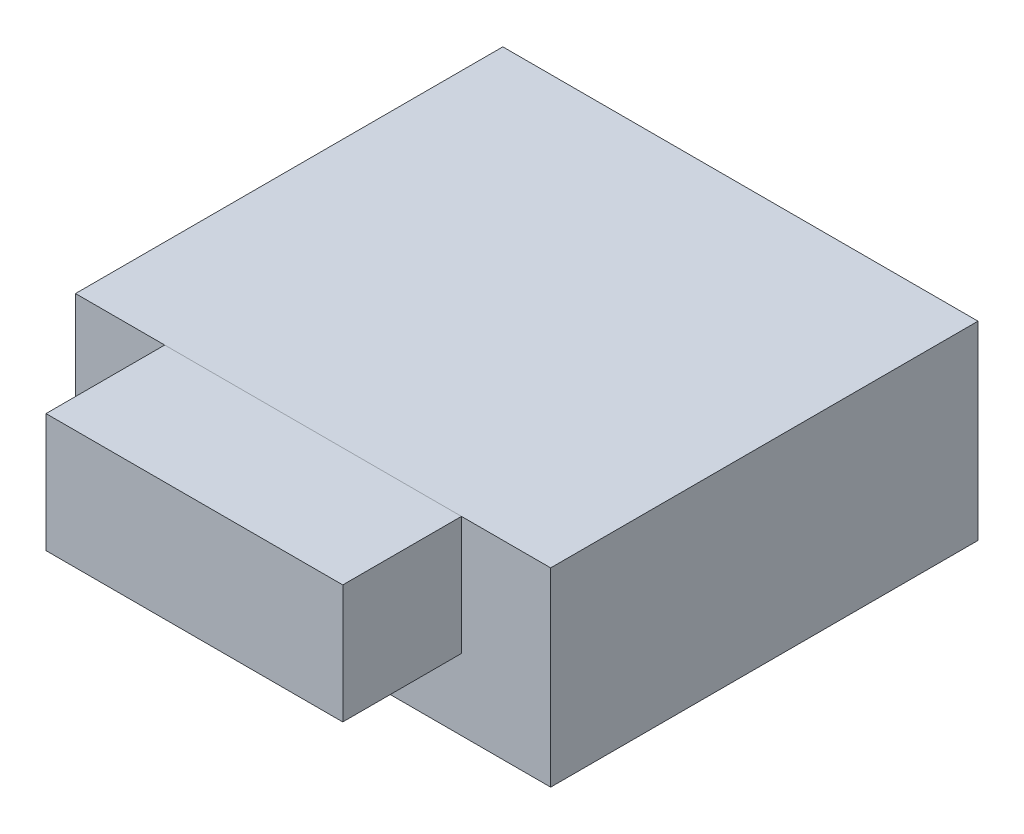
ISO-10303-21;
HEADER;
FILE_DESCRIPTION(('STEP AP214'),'2;1');
FILE_NAME('part.step','',(''),(''),'','','');
FILE_SCHEMA(('AUTOMOTIVE_DESIGN { 1 0 10303 214 1 1 1 1 }'));
ENDSEC;
DATA;
#1=APPLICATION_CONTEXT('core data for automotive mechanical design processes');
#2=APPLICATION_PROTOCOL_DEFINITION('international standard','automotive_design',2000,#1);
#3=PRODUCT_CONTEXT('',#1,'mechanical');
#4=PRODUCT('Part','Part','',(#3));
#5=PRODUCT_RELATED_PRODUCT_CATEGORY('part','',(#4));
#6=PRODUCT_DEFINITION_FORMATION('','',#4);
#7=PRODUCT_DEFINITION_CONTEXT('part definition',#1,'design');
#8=PRODUCT_DEFINITION('design','',#6,#7);
#9=PRODUCT_DEFINITION_SHAPE('','',#8);
#10=(LENGTH_UNIT() NAMED_UNIT(*) SI_UNIT(.MILLI.,.METRE.));
#11=(NAMED_UNIT(*) PLANE_ANGLE_UNIT() SI_UNIT($,.RADIAN.));
#12=(NAMED_UNIT(*) SI_UNIT($,.STERADIAN.) SOLID_ANGLE_UNIT());
#13=UNCERTAINTY_MEASURE_WITH_UNIT(LENGTH_MEASURE(1.E-05),#10,'distance_accuracy_value','');
#14=(GEOMETRIC_REPRESENTATION_CONTEXT(3) GLOBAL_UNCERTAINTY_ASSIGNED_CONTEXT((#13)) GLOBAL_UNIT_ASSIGNED_CONTEXT((#10,
#11,#12)) REPRESENTATION_CONTEXT('',''));
#15=CARTESIAN_POINT('',(0.,0.,0.));
#16=DIRECTION('',(0.,0.,1.));
#17=DIRECTION('',(1.,0.,0.));
#18=AXIS2_PLACEMENT_3D('',#15,#16,#17);
#19=CARTESIAN_POINT('',(-1.25,0.6,2.8));
#20=DIRECTION('',(1.,0.,0.));
#21=DIRECTION('',(0.,0.,-1.));
#22=AXIS2_PLACEMENT_3D('',#19,#20,#21);
#23=PLANE('',#22);
#24=DIRECTION('',(0.,-1.,0.));
#25=VECTOR('',#24,1.);
#26=CARTESIAN_POINT('',(-1.25,0.6,1.8));
#27=LINE('',#26,#25);
#28=CARTESIAN_POINT('',(-1.25,1.6,1.8));
#29=VERTEX_POINT('',#28);
#30=CARTESIAN_POINT('',(-1.25,0.6,1.8));
#31=VERTEX_POINT('',#30);
#32=EDGE_CURVE('E111',#29,#31,#27,.T.);
#33=ORIENTED_EDGE('',*,*,#32,.T.);
#34=DIRECTION('',(0.,0.,-1.));
#35=VECTOR('',#34,1.);
#36=CARTESIAN_POINT('',(-1.25,0.6,2.8));
#37=LINE('',#36,#35);
#38=CARTESIAN_POINT('',(-1.25,0.6,2.8));
#39=VERTEX_POINT('',#38);
#40=EDGE_CURVE('E12',#39,#31,#37,.T.);
#41=ORIENTED_EDGE('',*,*,#40,.F.);
#42=DIRECTION('',(0.,-1.,0.));
#43=VECTOR('',#42,1.);
#44=CARTESIAN_POINT('',(-1.25,0.6,2.8));
#45=LINE('',#44,#43);
#46=CARTESIAN_POINT('',(-1.25,1.6,2.8));
#47=VERTEX_POINT('',#46);
#48=EDGE_CURVE('E99',#47,#39,#45,.T.);
#49=ORIENTED_EDGE('',*,*,#48,.F.);
#50=DIRECTION('',(0.,0.,-1.));
#51=VECTOR('',#50,1.);
#52=CARTESIAN_POINT('',(-1.25,1.6,2.8));
#53=LINE('',#52,#51);
#54=EDGE_CURVE('E107',#47,#29,#53,.T.);
#55=ORIENTED_EDGE('',*,*,#54,.T.);
#56=EDGE_LOOP('',(#33,#41,#49,#55));
#57=FACE_BOUND('',#56,.T.);
#58=ADVANCED_FACE('F48',(#57),#23,.F.);
#59=CARTESIAN_POINT('',(1.25,0.6,2.8));
#60=DIRECTION('',(0.,1.,0.));
#61=DIRECTION('',(-1.,0.,0.));
#62=AXIS2_PLACEMENT_3D('',#59,#60,#61);
#63=PLANE('',#62);
#64=DIRECTION('',(1.,0.,0.));
#65=VECTOR('',#64,1.);
#66=CARTESIAN_POINT('',(1.25,0.6,1.8));
#67=LINE('',#66,#65);
#68=CARTESIAN_POINT('',(1.25,0.6,1.8));
#69=VERTEX_POINT('',#68);
#70=EDGE_CURVE('E103',#31,#69,#67,.T.);
#71=ORIENTED_EDGE('',*,*,#70,.T.);
#72=DIRECTION('',(0.,0.,-1.));
#73=VECTOR('',#72,1.);
#74=CARTESIAN_POINT('',(1.25,0.6,2.8));
#75=LINE('',#74,#73);
#76=CARTESIAN_POINT('',(1.25,0.6,2.8));
#77=VERTEX_POINT('',#76);
#78=EDGE_CURVE('E56',#77,#69,#75,.T.);
#79=ORIENTED_EDGE('',*,*,#78,.F.);
#80=DIRECTION('',(1.,0.,0.));
#81=VECTOR('',#80,1.);
#82=CARTESIAN_POINT('',(1.25,0.6,2.8));
#83=LINE('',#82,#81);
#84=EDGE_CURVE('E94',#39,#77,#83,.T.);
#85=ORIENTED_EDGE('',*,*,#84,.F.);
#86=ORIENTED_EDGE('',*,*,#40,.T.);
#87=EDGE_LOOP('',(#71,#79,#85,#86));
#88=FACE_BOUND('',#87,.T.);
#89=ADVANCED_FACE('F102',(#88),#63,.F.);
#90=CARTESIAN_POINT('',(1.25,0.6,2.8));
#91=DIRECTION('',(-1.,0.,0.));
#92=DIRECTION('',(0.,0.,1.));
#93=AXIS2_PLACEMENT_3D('',#90,#91,#92);
#94=PLANE('',#93);
#95=DIRECTION('',(0.,1.,0.));
#96=VECTOR('',#95,1.);
#97=CARTESIAN_POINT('',(1.25,0.6,1.8));
#98=LINE('',#97,#96);
#99=CARTESIAN_POINT('',(1.25,1.6,1.8));
#100=VERTEX_POINT('',#99);
#101=EDGE_CURVE('E81',#69,#100,#98,.T.);
#102=ORIENTED_EDGE('',*,*,#101,.T.);
#103=DIRECTION('',(0.,0.,-1.));
#104=VECTOR('',#103,1.);
#105=CARTESIAN_POINT('',(1.25,1.6,2.8));
#106=LINE('',#105,#104);
#107=CARTESIAN_POINT('',(1.25,1.6,2.8));
#108=VERTEX_POINT('',#107);
#109=EDGE_CURVE('E104',#108,#100,#106,.T.);
#110=ORIENTED_EDGE('',*,*,#109,.F.);
#111=DIRECTION('',(0.,1.,0.));
#112=VECTOR('',#111,1.);
#113=CARTESIAN_POINT('',(1.25,0.6,2.8));
#114=LINE('',#113,#112);
#115=EDGE_CURVE('E97',#77,#108,#114,.T.);
#116=ORIENTED_EDGE('',*,*,#115,.F.);
#117=ORIENTED_EDGE('',*,*,#78,.T.);
#118=EDGE_LOOP('',(#102,#110,#116,#117));
#119=FACE_BOUND('',#118,.T.);
#120=ADVANCED_FACE('F105',(#119),#94,.F.);
#121=CARTESIAN_POINT('',(1.25,1.6,2.8));
#122=DIRECTION('',(0.,-1.,0.));
#123=DIRECTION('',(0.,0.,-1.));
#124=AXIS2_PLACEMENT_3D('',#121,#122,#123);
#125=PLANE('',#124);
#126=DIRECTION('',(-1.,0.,0.));
#127=VECTOR('',#126,1.);
#128=CARTESIAN_POINT('',(1.25,1.6,1.8));
#129=LINE('',#128,#127);
#130=EDGE_CURVE('E87',#100,#29,#129,.T.);
#131=ORIENTED_EDGE('',*,*,#130,.T.);
#132=ORIENTED_EDGE('',*,*,#54,.F.);
#133=DIRECTION('',(-1.,0.,0.));
#134=VECTOR('',#133,1.);
#135=CARTESIAN_POINT('',(1.25,1.6,2.8));
#136=LINE('',#135,#134);
#137=EDGE_CURVE('E64',#108,#47,#136,.T.);
#138=ORIENTED_EDGE('',*,*,#137,.F.);
#139=ORIENTED_EDGE('',*,*,#109,.T.);
#140=EDGE_LOOP('',(#131,#132,#138,#139));
#141=FACE_BOUND('',#140,.T.);
#142=ADVANCED_FACE('F118',(#141),#125,.F.);
#143=CARTESIAN_POINT('',(0.,0.,2.8));
#144=DIRECTION('',(0.,0.,1.));
#145=DIRECTION('',(1.,0.,0.));
#146=AXIS2_PLACEMENT_3D('',#143,#144,#145);
#147=PLANE('',#146);
#148=ORIENTED_EDGE('',*,*,#48,.T.);
#149=ORIENTED_EDGE('',*,*,#84,.T.);
#150=ORIENTED_EDGE('',*,*,#115,.T.);
#151=ORIENTED_EDGE('',*,*,#137,.T.);
#152=EDGE_LOOP('',(#148,#149,#150,#151));
#153=FACE_BOUND('',#152,.T.);
#154=ADVANCED_FACE('F95',(#153),#147,.T.);
#155=CARTESIAN_POINT('',(0.,0.,1.8));
#156=DIRECTION('',(0.,0.,1.));
#157=DIRECTION('',(1.,0.,0.));
#158=AXIS2_PLACEMENT_3D('',#155,#156,#157);
#159=PLANE('',#158);
#160=ORIENTED_EDGE('',*,*,#32,.F.);
#161=ORIENTED_EDGE('',*,*,#130,.F.);
#162=ORIENTED_EDGE('',*,*,#101,.F.);
#163=ORIENTED_EDGE('',*,*,#70,.F.);
#164=EDGE_LOOP('',(#160,#161,#162,#163));
#165=FACE_BOUND('',#164,.T.);
#166=ADVANCED_FACE('F121',(#165),#159,.F.);
#167=CLOSED_SHELL('',(#58,#89,#120,#142,#154,#166));
#168=MANIFOLD_SOLID_BREP('B2',#167);
#169=CARTESIAN_POINT('',(-2.00147782,1.6,1.8));
#170=DIRECTION('',(1.,0.,0.));
#171=DIRECTION('',(0.,0.,-1.));
#172=AXIS2_PLACEMENT_3D('',#169,#170,#171);
#173=PLANE('',#172);
#174=DIRECTION('',(0.,0.,1.));
#175=VECTOR('',#174,1.);
#176=CARTESIAN_POINT('',(-2.00147782,0.,1.8));
#177=LINE('',#176,#175);
#178=CARTESIAN_POINT('',(-2.00147782,0.,-1.8));
#179=VERTEX_POINT('',#178);
#180=CARTESIAN_POINT('',(-2.00147782,0.,1.8));
#181=VERTEX_POINT('',#180);
#182=EDGE_CURVE('E234',#179,#181,#177,.T.);
#183=ORIENTED_EDGE('',*,*,#182,.T.);
#184=DIRECTION('',(0.,-1.,0.));
#185=VECTOR('',#184,1.);
#186=CARTESIAN_POINT('',(-2.00147782,1.6,1.8));
#187=LINE('',#186,#185);
#188=CARTESIAN_POINT('',(-2.00147782,1.6,1.8));
#189=VERTEX_POINT('',#188);
#190=EDGE_CURVE('E46',#189,#181,#187,.T.);
#191=ORIENTED_EDGE('',*,*,#190,.F.);
#192=DIRECTION('',(0.,0.,1.));
#193=VECTOR('',#192,1.);
#194=CARTESIAN_POINT('',(-2.00147782,1.6,1.8));
#195=LINE('',#194,#193);
#196=CARTESIAN_POINT('',(-2.00147782,1.6,-1.8));
#197=VERTEX_POINT('',#196);
#198=EDGE_CURVE('E222',#197,#189,#195,.T.);
#199=ORIENTED_EDGE('',*,*,#198,.F.);
#200=DIRECTION('',(0.,-1.,0.));
#201=VECTOR('',#200,1.);
#202=CARTESIAN_POINT('',(-2.00147782,1.6,-1.8));
#203=LINE('',#202,#201);
#204=EDGE_CURVE('E230',#197,#179,#203,.T.);
#205=ORIENTED_EDGE('',*,*,#204,.T.);
#206=EDGE_LOOP('',(#183,#191,#199,#205));
#207=FACE_BOUND('',#206,.T.);
#208=ADVANCED_FACE('F171',(#207),#173,.F.);
#209=CARTESIAN_POINT('',(2.00147782,1.6,1.8));
#210=DIRECTION('',(0.,0.,-1.));
#211=DIRECTION('',(-1.,0.,0.));
#212=AXIS2_PLACEMENT_3D('',#209,#210,#211);
#213=PLANE('',#212);
#214=DIRECTION('',(1.,0.,0.));
#215=VECTOR('',#214,1.);
#216=CARTESIAN_POINT('',(2.00147782,0.,1.8));
#217=LINE('',#216,#215);
#218=CARTESIAN_POINT('',(2.00147782,0.,1.8));
#219=VERTEX_POINT('',#218);
#220=EDGE_CURVE('E226',#181,#219,#217,.T.);
#221=ORIENTED_EDGE('',*,*,#220,.T.);
#222=DIRECTION('',(0.,-1.,0.));
#223=VECTOR('',#222,1.);
#224=CARTESIAN_POINT('',(2.00147782,1.6,1.8));
#225=LINE('',#224,#223);
#226=CARTESIAN_POINT('',(2.00147782,1.6,1.8));
#227=VERTEX_POINT('',#226);
#228=EDGE_CURVE('E179',#227,#219,#225,.T.);
#229=ORIENTED_EDGE('',*,*,#228,.F.);
#230=DIRECTION('',(1.,0.,0.));
#231=VECTOR('',#230,1.);
#232=CARTESIAN_POINT('',(2.00147782,1.6,1.8));
#233=LINE('',#232,#231);
#234=EDGE_CURVE('E217',#189,#227,#233,.T.);
#235=ORIENTED_EDGE('',*,*,#234,.F.);
#236=ORIENTED_EDGE('',*,*,#190,.T.);
#237=EDGE_LOOP('',(#221,#229,#235,#236));
#238=FACE_BOUND('',#237,.T.);
#239=ADVANCED_FACE('F225',(#238),#213,.F.);
#240=CARTESIAN_POINT('',(2.00147782,1.6,1.8));
#241=DIRECTION('',(-1.,0.,0.));
#242=DIRECTION('',(0.,0.,1.));
#243=AXIS2_PLACEMENT_3D('',#240,#241,#242);
#244=PLANE('',#243);
#245=DIRECTION('',(0.,0.,-1.));
#246=VECTOR('',#245,1.);
#247=CARTESIAN_POINT('',(2.00147782,0.,1.8));
#248=LINE('',#247,#246);
#249=CARTESIAN_POINT('',(2.00147782,0.,-1.8));
#250=VERTEX_POINT('',#249);
#251=EDGE_CURVE('E204',#219,#250,#248,.T.);
#252=ORIENTED_EDGE('',*,*,#251,.T.);
#253=DIRECTION('',(0.,-1.,0.));
#254=VECTOR('',#253,1.);
#255=CARTESIAN_POINT('',(2.00147782,1.6,-1.8));
#256=LINE('',#255,#254);
#257=CARTESIAN_POINT('',(2.00147782,1.6,-1.8));
#258=VERTEX_POINT('',#257);
#259=EDGE_CURVE('E227',#258,#250,#256,.T.);
#260=ORIENTED_EDGE('',*,*,#259,.F.);
#261=DIRECTION('',(0.,0.,-1.));
#262=VECTOR('',#261,1.);
#263=CARTESIAN_POINT('',(2.00147782,1.6,1.8));
#264=LINE('',#263,#262);
#265=EDGE_CURVE('E220',#227,#258,#264,.T.);
#266=ORIENTED_EDGE('',*,*,#265,.F.);
#267=ORIENTED_EDGE('',*,*,#228,.T.);
#268=EDGE_LOOP('',(#252,#260,#266,#267));
#269=FACE_BOUND('',#268,.T.);
#270=ADVANCED_FACE('F228',(#269),#244,.F.);
#271=CARTESIAN_POINT('',(2.00147782,1.6,-1.8));
#272=DIRECTION('',(0.,0.,1.));
#273=DIRECTION('',(1.,0.,0.));
#274=AXIS2_PLACEMENT_3D('',#271,#272,#273);
#275=PLANE('',#274);
#276=DIRECTION('',(-1.,0.,0.));
#277=VECTOR('',#276,1.);
#278=CARTESIAN_POINT('',(2.00147782,0.,-1.8));
#279=LINE('',#278,#277);
#280=EDGE_CURVE('E210',#250,#179,#279,.T.);
#281=ORIENTED_EDGE('',*,*,#280,.T.);
#282=ORIENTED_EDGE('',*,*,#204,.F.);
#283=DIRECTION('',(-1.,0.,0.));
#284=VECTOR('',#283,1.);
#285=CARTESIAN_POINT('',(2.00147782,1.6,-1.8));
#286=LINE('',#285,#284);
#287=EDGE_CURVE('E187',#258,#197,#286,.T.);
#288=ORIENTED_EDGE('',*,*,#287,.F.);
#289=ORIENTED_EDGE('',*,*,#259,.T.);
#290=EDGE_LOOP('',(#281,#282,#288,#289));
#291=FACE_BOUND('',#290,.T.);
#292=ADVANCED_FACE('F241',(#291),#275,.F.);
#293=CARTESIAN_POINT('',(0.,1.6,0.));
#294=DIRECTION('',(0.,1.,0.));
#295=DIRECTION('',(0.,0.,1.));
#296=AXIS2_PLACEMENT_3D('',#293,#294,#295);
#297=PLANE('',#296);
#298=ORIENTED_EDGE('',*,*,#198,.T.);
#299=ORIENTED_EDGE('',*,*,#234,.T.);
#300=ORIENTED_EDGE('',*,*,#265,.T.);
#301=ORIENTED_EDGE('',*,*,#287,.T.);
#302=EDGE_LOOP('',(#298,#299,#300,#301));
#303=FACE_BOUND('',#302,.T.);
#304=ADVANCED_FACE('F218',(#303),#297,.T.);
#305=CARTESIAN_POINT('',(0.,0.,0.));
#306=DIRECTION('',(0.,1.,0.));
#307=DIRECTION('',(0.,0.,1.));
#308=AXIS2_PLACEMENT_3D('',#305,#306,#307);
#309=PLANE('',#308);
#310=ORIENTED_EDGE('',*,*,#182,.F.);
#311=ORIENTED_EDGE('',*,*,#280,.F.);
#312=ORIENTED_EDGE('',*,*,#251,.F.);
#313=ORIENTED_EDGE('',*,*,#220,.F.);
#314=EDGE_LOOP('',(#310,#311,#312,#313));
#315=FACE_BOUND('',#314,.T.);
#316=ADVANCED_FACE('F244',(#315),#309,.F.);
#317=CLOSED_SHELL('',(#208,#239,#270,#292,#304,#316));
#318=MANIFOLD_SOLID_BREP('B6',#317);
#319=ADVANCED_BREP_SHAPE_REPRESENTATION('',(#18,#168,#318),#14);
#320=SHAPE_DEFINITION_REPRESENTATION(#9,#319);
ENDSEC;
END-ISO-10303-21;
